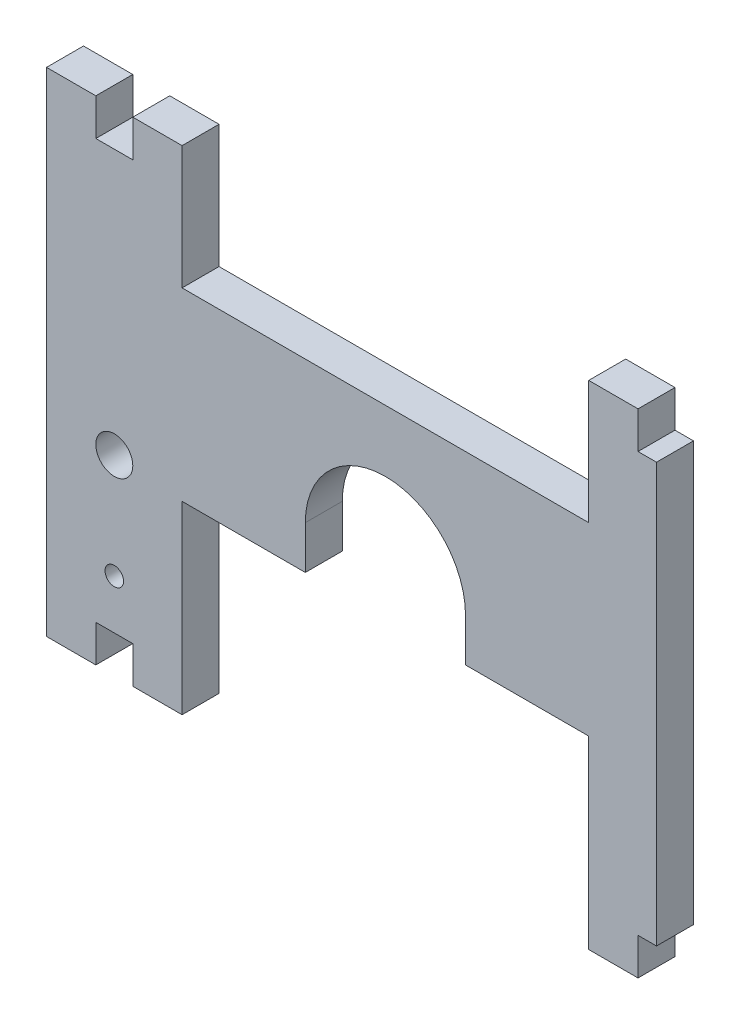
ISO-10303-21;
HEADER;
FILE_DESCRIPTION(('STEP AP214'),'2;1');
FILE_NAME('part.step','',(''),(''),'','','');
FILE_SCHEMA(('AUTOMOTIVE_DESIGN { 1 0 10303 214 1 1 1 1 }'));
ENDSEC;
DATA;
#1=APPLICATION_CONTEXT('core data for automotive mechanical design processes');
#2=APPLICATION_PROTOCOL_DEFINITION('international standard','automotive_design',2000,#1);
#3=PRODUCT_CONTEXT('',#1,'mechanical');
#4=PRODUCT('Part','Part','',(#3));
#5=PRODUCT_RELATED_PRODUCT_CATEGORY('part','',(#4));
#6=PRODUCT_DEFINITION_FORMATION('','',#4);
#7=PRODUCT_DEFINITION_CONTEXT('part definition',#1,'design');
#8=PRODUCT_DEFINITION('design','',#6,#7);
#9=PRODUCT_DEFINITION_SHAPE('','',#8);
#10=(LENGTH_UNIT() NAMED_UNIT(*) SI_UNIT(.MILLI.,.METRE.));
#11=(NAMED_UNIT(*) PLANE_ANGLE_UNIT() SI_UNIT($,.RADIAN.));
#12=(NAMED_UNIT(*) SI_UNIT($,.STERADIAN.) SOLID_ANGLE_UNIT());
#13=UNCERTAINTY_MEASURE_WITH_UNIT(LENGTH_MEASURE(1.E-05),#10,'distance_accuracy_value','');
#14=(GEOMETRIC_REPRESENTATION_CONTEXT(3) GLOBAL_UNCERTAINTY_ASSIGNED_CONTEXT((#13)) GLOBAL_UNIT_ASSIGNED_CONTEXT((#10,
#11,#12)) REPRESENTATION_CONTEXT('',''));
#15=CARTESIAN_POINT('',(0.,0.,0.));
#16=DIRECTION('',(0.,0.,1.));
#17=DIRECTION('',(1.,0.,0.));
#18=AXIS2_PLACEMENT_3D('',#15,#16,#17);
#19=CARTESIAN_POINT('',(0.,6.,6.));
#20=DIRECTION('',(0.,1.,0.));
#21=DIRECTION('',(0.,0.,1.));
#22=AXIS2_PLACEMENT_3D('',#19,#20,#21);
#23=PLANE('',#22);
#24=DIRECTION('',(1.,0.,0.));
#25=VECTOR('',#24,1.);
#26=CARTESIAN_POINT('',(0.,6.,0.));
#27=LINE('',#26,#25);
#28=CARTESIAN_POINT('',(-14.,6.,0.));
#29=VERTEX_POINT('',#28);
#30=CARTESIAN_POINT('',(-8.,6.,0.));
#31=VERTEX_POINT('',#30);
#32=EDGE_CURVE('E322',#29,#31,#27,.T.);
#33=ORIENTED_EDGE('',*,*,#32,.T.);
#34=DIRECTION('',(0.,0.,-1.));
#35=VECTOR('',#34,1.);
#36=CARTESIAN_POINT('',(-8.,6.,6.));
#37=LINE('',#36,#35);
#38=CARTESIAN_POINT('',(-8.,6.,6.));
#39=VERTEX_POINT('',#38);
#40=EDGE_CURVE('E44',#39,#31,#37,.T.);
#41=ORIENTED_EDGE('',*,*,#40,.F.);
#42=DIRECTION('',(1.,0.,0.));
#43=VECTOR('',#42,1.);
#44=CARTESIAN_POINT('',(0.,6.,6.));
#45=LINE('',#44,#43);
#46=CARTESIAN_POINT('',(-14.,6.,6.));
#47=VERTEX_POINT('',#46);
#48=EDGE_CURVE('E261',#47,#39,#45,.T.);
#49=ORIENTED_EDGE('',*,*,#48,.F.);
#50=DIRECTION('',(0.,0.,-1.));
#51=VECTOR('',#50,1.);
#52=CARTESIAN_POINT('',(-14.,6.,6.));
#53=LINE('',#52,#51);
#54=EDGE_CURVE('E251',#47,#29,#53,.T.);
#55=ORIENTED_EDGE('',*,*,#54,.T.);
#56=EDGE_LOOP('',(#33,#41,#49,#55));
#57=FACE_BOUND('',#56,.T.);
#58=ADVANCED_FACE('F37',(#57),#23,.F.);
#59=CARTESIAN_POINT('',(-8.,0.,6.));
#60=DIRECTION('',(1.,0.,0.));
#61=DIRECTION('',(0.,1.,0.));
#62=AXIS2_PLACEMENT_3D('',#59,#60,#61);
#63=PLANE('',#62);
#64=DIRECTION('',(0.,-1.,0.));
#65=VECTOR('',#64,1.);
#66=CARTESIAN_POINT('',(-8.,0.,0.));
#67=LINE('',#66,#65);
#68=CARTESIAN_POINT('',(-8.,0.,0.));
#69=VERTEX_POINT('',#68);
#70=EDGE_CURVE('E325',#31,#69,#67,.T.);
#71=ORIENTED_EDGE('',*,*,#70,.T.);
#72=DIRECTION('',(0.,0.,-1.));
#73=VECTOR('',#72,1.);
#74=CARTESIAN_POINT('',(-8.,0.,6.));
#75=LINE('',#74,#73);
#76=CARTESIAN_POINT('',(-8.,0.,6.));
#77=VERTEX_POINT('',#76);
#78=EDGE_CURVE('E430',#77,#69,#75,.T.);
#79=ORIENTED_EDGE('',*,*,#78,.F.);
#80=DIRECTION('',(0.,-1.,0.));
#81=VECTOR('',#80,1.);
#82=CARTESIAN_POINT('',(-8.,0.,6.));
#83=LINE('',#82,#81);
#84=EDGE_CURVE('E155',#39,#77,#83,.T.);
#85=ORIENTED_EDGE('',*,*,#84,.F.);
#86=ORIENTED_EDGE('',*,*,#40,.T.);
#87=EDGE_LOOP('',(#71,#79,#85,#86));
#88=FACE_BOUND('',#87,.T.);
#89=ADVANCED_FACE('F453',(#88),#63,.F.);
#90=CARTESIAN_POINT('',(0.,0.,6.));
#91=DIRECTION('',(0.,-1.,0.));
#92=DIRECTION('',(1.,0.,0.));
#93=AXIS2_PLACEMENT_3D('',#90,#91,#92);
#94=PLANE('',#93);
#95=DIRECTION('',(-1.,0.,0.));
#96=VECTOR('',#95,1.);
#97=CARTESIAN_POINT('',(0.,0.,0.));
#98=LINE('',#97,#96);
#99=CARTESIAN_POINT('',(0.,0.,0.));
#100=VERTEX_POINT('',#99);
#101=EDGE_CURVE('E328',#100,#69,#98,.T.);
#102=ORIENTED_EDGE('',*,*,#101,.F.);
#103=DIRECTION('',(0.,0.,-1.));
#104=VECTOR('',#103,1.);
#105=CARTESIAN_POINT('',(0.,0.,6.));
#106=LINE('',#105,#104);
#107=CARTESIAN_POINT('',(0.,0.,6.));
#108=VERTEX_POINT('',#107);
#109=EDGE_CURVE('E428',#108,#100,#106,.T.);
#110=ORIENTED_EDGE('',*,*,#109,.F.);
#111=DIRECTION('',(-1.,0.,0.));
#112=VECTOR('',#111,1.);
#113=CARTESIAN_POINT('',(0.,0.,6.));
#114=LINE('',#113,#112);
#115=EDGE_CURVE('E250',#108,#77,#114,.T.);
#116=ORIENTED_EDGE('',*,*,#115,.T.);
#117=ORIENTED_EDGE('',*,*,#78,.T.);
#118=EDGE_LOOP('',(#102,#110,#116,#117));
#119=FACE_BOUND('',#118,.T.);
#120=ADVANCED_FACE('F458',(#119),#94,.T.);
#121=CARTESIAN_POINT('',(0.,0.,6.));
#122=DIRECTION('',(-1.,0.,0.));
#123=DIRECTION('',(0.,0.,1.));
#124=AXIS2_PLACEMENT_3D('',#121,#122,#123);
#125=PLANE('',#124);
#126=DIRECTION('',(0.,1.,0.));
#127=VECTOR('',#126,1.);
#128=CARTESIAN_POINT('',(0.,0.,0.));
#129=LINE('',#128,#127);
#130=CARTESIAN_POINT('',(0.,30.,0.));
#131=VERTEX_POINT('',#130);
#132=EDGE_CURVE('E331',#100,#131,#129,.T.);
#133=ORIENTED_EDGE('',*,*,#132,.T.);
#134=DIRECTION('',(0.,0.,-1.));
#135=VECTOR('',#134,1.);
#136=CARTESIAN_POINT('',(0.,30.,6.));
#137=LINE('',#136,#135);
#138=CARTESIAN_POINT('',(0.,30.,6.));
#139=VERTEX_POINT('',#138);
#140=EDGE_CURVE('E426',#139,#131,#137,.T.);
#141=ORIENTED_EDGE('',*,*,#140,.F.);
#142=DIRECTION('',(0.,1.,0.));
#143=VECTOR('',#142,1.);
#144=CARTESIAN_POINT('',(0.,0.,6.));
#145=LINE('',#144,#143);
#146=EDGE_CURVE('E256',#108,#139,#145,.T.);
#147=ORIENTED_EDGE('',*,*,#146,.F.);
#148=ORIENTED_EDGE('',*,*,#109,.T.);
#149=EDGE_LOOP('',(#133,#141,#147,#148));
#150=FACE_BOUND('',#149,.T.);
#151=ADVANCED_FACE('F468',(#150),#125,.F.);
#152=CARTESIAN_POINT('',(0.,30.,6.));
#153=DIRECTION('',(0.,-1.,0.));
#154=DIRECTION('',(1.,0.,0.));
#155=AXIS2_PLACEMENT_3D('',#152,#153,#154);
#156=PLANE('',#155);
#157=DIRECTION('',(-1.,0.,0.));
#158=VECTOR('',#157,1.);
#159=CARTESIAN_POINT('',(0.,30.,0.));
#160=LINE('',#159,#158);
#161=CARTESIAN_POINT('',(20.,30.,0.));
#162=VERTEX_POINT('',#161);
#163=EDGE_CURVE('E335',#162,#131,#160,.T.);
#164=ORIENTED_EDGE('',*,*,#163,.F.);
#165=DIRECTION('',(0.,0.,-1.));
#166=VECTOR('',#165,1.);
#167=CARTESIAN_POINT('',(20.,30.,6.));
#168=LINE('',#167,#166);
#169=CARTESIAN_POINT('',(20.,30.,6.));
#170=VERTEX_POINT('',#169);
#171=EDGE_CURVE('E424',#170,#162,#168,.T.);
#172=ORIENTED_EDGE('',*,*,#171,.F.);
#173=DIRECTION('',(-1.,0.,0.));
#174=VECTOR('',#173,1.);
#175=CARTESIAN_POINT('',(0.,30.,6.));
#176=LINE('',#175,#174);
#177=EDGE_CURVE('E259',#170,#139,#176,.T.);
#178=ORIENTED_EDGE('',*,*,#177,.T.);
#179=ORIENTED_EDGE('',*,*,#140,.T.);
#180=EDGE_LOOP('',(#164,#172,#178,#179));
#181=FACE_BOUND('',#180,.T.);
#182=ADVANCED_FACE('F569',(#181),#156,.T.);
#183=CARTESIAN_POINT('',(20.,0.,6.));
#184=DIRECTION('',(1.,0.,0.));
#185=DIRECTION('',(0.,1.,0.));
#186=AXIS2_PLACEMENT_3D('',#183,#184,#185);
#187=PLANE('',#186);
#188=DIRECTION('',(0.,-1.,0.));
#189=VECTOR('',#188,1.);
#190=CARTESIAN_POINT('',(20.,0.,0.));
#191=LINE('',#190,#189);
#192=CARTESIAN_POINT('',(20.,37.,0.));
#193=VERTEX_POINT('',#192);
#194=EDGE_CURVE('E339',#193,#162,#191,.T.);
#195=ORIENTED_EDGE('',*,*,#194,.F.);
#196=DIRECTION('',(0.,0.,-1.));
#197=VECTOR('',#196,1.);
#198=CARTESIAN_POINT('',(20.,37.,6.));
#199=LINE('',#198,#197);
#200=CARTESIAN_POINT('',(20.,37.,6.));
#201=VERTEX_POINT('',#200);
#202=EDGE_CURVE('E422',#201,#193,#199,.T.);
#203=ORIENTED_EDGE('',*,*,#202,.F.);
#204=DIRECTION('',(0.,-1.,0.));
#205=VECTOR('',#204,1.);
#206=CARTESIAN_POINT('',(20.,0.,6.));
#207=LINE('',#206,#205);
#208=EDGE_CURVE('E474',#201,#170,#207,.T.);
#209=ORIENTED_EDGE('',*,*,#208,.T.);
#210=ORIENTED_EDGE('',*,*,#171,.T.);
#211=EDGE_LOOP('',(#195,#203,#209,#210));
#212=FACE_BOUND('',#211,.T.);
#213=ADVANCED_FACE('F481',(#212),#187,.T.);
#214=CARTESIAN_POINT('',(33.,37.,6.));
#215=DIRECTION('',(0.,0.,-1.));
#216=DIRECTION('',(-1.,0.,0.));
#217=AXIS2_PLACEMENT_3D('',#214,#215,#216);
#218=CYLINDRICAL_SURFACE('',#217,13.);
#219=CARTESIAN_POINT('',(33.,37.,0.));
#220=DIRECTION('',(0.,0.,1.));
#221=DIRECTION('',(1.,0.,0.));
#222=AXIS2_PLACEMENT_3D('',#219,#220,#221);
#223=CIRCLE('',#222,13.);
#224=CARTESIAN_POINT('',(46.,37.,0.));
#225=VERTEX_POINT('',#224);
#226=EDGE_CURVE('E343',#225,#193,#223,.T.);
#227=ORIENTED_EDGE('',*,*,#226,.F.);
#228=DIRECTION('',(0.,0.,-1.));
#229=VECTOR('',#228,1.);
#230=CARTESIAN_POINT('',(46.,37.,6.));
#231=LINE('',#230,#229);
#232=CARTESIAN_POINT('',(46.,37.,6.));
#233=VERTEX_POINT('',#232);
#234=EDGE_CURVE('E420',#233,#225,#231,.T.);
#235=ORIENTED_EDGE('',*,*,#234,.F.);
#236=CARTESIAN_POINT('',(33.,37.,6.));
#237=DIRECTION('',(0.,0.,1.));
#238=DIRECTION('',(1.,0.,0.));
#239=AXIS2_PLACEMENT_3D('',#236,#237,#238);
#240=CIRCLE('',#239,13.);
#241=EDGE_CURVE('E483',#233,#201,#240,.T.);
#242=ORIENTED_EDGE('',*,*,#241,.T.);
#243=ORIENTED_EDGE('',*,*,#202,.T.);
#244=EDGE_LOOP('',(#227,#235,#242,#243));
#245=FACE_BOUND('',#244,.T.);
#246=ADVANCED_FACE('F759',(#245),#218,.F.);
#247=CARTESIAN_POINT('',(46.,0.,6.));
#248=DIRECTION('',(1.,0.,0.));
#249=DIRECTION('',(0.,0.,-1.));
#250=AXIS2_PLACEMENT_3D('',#247,#248,#249);
#251=PLANE('',#250);
#252=DIRECTION('',(0.,-1.,0.));
#253=VECTOR('',#252,1.);
#254=CARTESIAN_POINT('',(46.,0.,0.));
#255=LINE('',#254,#253);
#256=CARTESIAN_POINT('',(46.,30.,0.));
#257=VERTEX_POINT('',#256);
#258=EDGE_CURVE('E346',#225,#257,#255,.T.);
#259=ORIENTED_EDGE('',*,*,#258,.T.);
#260=DIRECTION('',(0.,0.,-1.));
#261=VECTOR('',#260,1.);
#262=CARTESIAN_POINT('',(46.,30.,6.));
#263=LINE('',#262,#261);
#264=CARTESIAN_POINT('',(46.,30.,6.));
#265=VERTEX_POINT('',#264);
#266=EDGE_CURVE('E418',#265,#257,#263,.T.);
#267=ORIENTED_EDGE('',*,*,#266,.F.);
#268=DIRECTION('',(0.,-1.,0.));
#269=VECTOR('',#268,1.);
#270=CARTESIAN_POINT('',(46.,0.,6.));
#271=LINE('',#270,#269);
#272=EDGE_CURVE('E485',#233,#265,#271,.T.);
#273=ORIENTED_EDGE('',*,*,#272,.F.);
#274=ORIENTED_EDGE('',*,*,#234,.T.);
#275=EDGE_LOOP('',(#259,#267,#273,#274));
#276=FACE_BOUND('',#275,.T.);
#277=ADVANCED_FACE('F750',(#276),#251,.F.);
#278=CARTESIAN_POINT('',(66.,30.,0.));
#279=VERTEX_POINT('',#278);
#280=EDGE_CURVE('E340',#279,#257,#160,.T.);
#281=ORIENTED_EDGE('',*,*,#280,.F.);
#282=DIRECTION('',(0.,0.,-1.));
#283=VECTOR('',#282,1.);
#284=CARTESIAN_POINT('',(66.,30.,6.));
#285=LINE('',#284,#283);
#286=CARTESIAN_POINT('',(66.,30.,6.));
#287=VERTEX_POINT('',#286);
#288=EDGE_CURVE('E416',#287,#279,#285,.T.);
#289=ORIENTED_EDGE('',*,*,#288,.F.);
#290=EDGE_CURVE('E478',#287,#265,#176,.T.);
#291=ORIENTED_EDGE('',*,*,#290,.T.);
#292=ORIENTED_EDGE('',*,*,#266,.T.);
#293=EDGE_LOOP('',(#281,#289,#291,#292));
#294=FACE_BOUND('',#293,.T.);
#295=ADVANCED_FACE('F575',(#294),#156,.T.);
#296=CARTESIAN_POINT('',(66.,0.,6.));
#297=DIRECTION('',(1.,0.,0.));
#298=DIRECTION('',(0.,1.,0.));
#299=AXIS2_PLACEMENT_3D('',#296,#297,#298);
#300=PLANE('',#299);
#301=DIRECTION('',(0.,-1.,0.));
#302=VECTOR('',#301,1.);
#303=CARTESIAN_POINT('',(66.,0.,0.));
#304=LINE('',#303,#302);
#305=CARTESIAN_POINT('',(66.,0.,0.));
#306=VERTEX_POINT('',#305);
#307=EDGE_CURVE('E349',#279,#306,#304,.T.);
#308=ORIENTED_EDGE('',*,*,#307,.T.);
#309=DIRECTION('',(0.,0.,-1.));
#310=VECTOR('',#309,1.);
#311=CARTESIAN_POINT('',(66.,0.,6.));
#312=LINE('',#311,#310);
#313=CARTESIAN_POINT('',(66.,0.,6.));
#314=VERTEX_POINT('',#313);
#315=EDGE_CURVE('E413',#314,#306,#312,.T.);
#316=ORIENTED_EDGE('',*,*,#315,.F.);
#317=DIRECTION('',(0.,-1.,0.));
#318=VECTOR('',#317,1.);
#319=CARTESIAN_POINT('',(66.,0.,6.));
#320=LINE('',#319,#318);
#321=EDGE_CURVE('E489',#287,#314,#320,.T.);
#322=ORIENTED_EDGE('',*,*,#321,.F.);
#323=ORIENTED_EDGE('',*,*,#288,.T.);
#324=EDGE_LOOP('',(#308,#316,#322,#323));
#325=FACE_BOUND('',#324,.T.);
#326=ADVANCED_FACE('F704',(#325),#300,.F.);
#327=CARTESIAN_POINT('',(0.,0.,6.));
#328=DIRECTION('',(0.,1.,0.));
#329=DIRECTION('',(0.,0.,1.));
#330=AXIS2_PLACEMENT_3D('',#327,#328,#329);
#331=PLANE('',#330);
#332=DIRECTION('',(1.,0.,0.));
#333=VECTOR('',#332,1.);
#334=CARTESIAN_POINT('',(0.,0.,0.));
#335=LINE('',#334,#333);
#336=CARTESIAN_POINT('',(74.,0.,0.));
#337=VERTEX_POINT('',#336);
#338=EDGE_CURVE('E351',#306,#337,#335,.T.);
#339=ORIENTED_EDGE('',*,*,#338,.T.);
#340=DIRECTION('',(0.,0.,-1.));
#341=VECTOR('',#340,1.);
#342=CARTESIAN_POINT('',(74.,0.,6.));
#343=LINE('',#342,#341);
#344=CARTESIAN_POINT('',(74.,0.,6.));
#345=VERTEX_POINT('',#344);
#346=EDGE_CURVE('E410',#345,#337,#343,.T.);
#347=ORIENTED_EDGE('',*,*,#346,.F.);
#348=DIRECTION('',(1.,0.,0.));
#349=VECTOR('',#348,1.);
#350=CARTESIAN_POINT('',(0.,0.,6.));
#351=LINE('',#350,#349);
#352=EDGE_CURVE('E299',#314,#345,#351,.T.);
#353=ORIENTED_EDGE('',*,*,#352,.F.);
#354=ORIENTED_EDGE('',*,*,#315,.T.);
#355=EDGE_LOOP('',(#339,#347,#353,#354));
#356=FACE_BOUND('',#355,.T.);
#357=ADVANCED_FACE('F496',(#356),#331,.F.);
#358=CARTESIAN_POINT('',(74.,1.71159382963045E-13,6.));
#359=DIRECTION('',(-1.,0.,0.));
#360=DIRECTION('',(0.,-1.,0.));
#361=AXIS2_PLACEMENT_3D('',#358,#359,#360);
#362=PLANE('',#361);
#363=DIRECTION('',(0.,1.,0.));
#364=VECTOR('',#363,1.);
#365=CARTESIAN_POINT('',(74.,1.71159382963045E-13,0.));
#366=LINE('',#365,#364);
#367=CARTESIAN_POINT('',(74.,6.,0.));
#368=VERTEX_POINT('',#367);
#369=EDGE_CURVE('E354',#337,#368,#366,.T.);
#370=ORIENTED_EDGE('',*,*,#369,.T.);
#371=DIRECTION('',(0.,0.,-1.));
#372=VECTOR('',#371,1.);
#373=CARTESIAN_POINT('',(74.,6.,6.));
#374=LINE('',#373,#372);
#375=CARTESIAN_POINT('',(74.,6.,6.));
#376=VERTEX_POINT('',#375);
#377=EDGE_CURVE('E408',#376,#368,#374,.T.);
#378=ORIENTED_EDGE('',*,*,#377,.F.);
#379=DIRECTION('',(0.,1.,0.));
#380=VECTOR('',#379,1.);
#381=CARTESIAN_POINT('',(74.,1.71159382963045E-13,6.));
#382=LINE('',#381,#380);
#383=EDGE_CURVE('E293',#345,#376,#382,.T.);
#384=ORIENTED_EDGE('',*,*,#383,.F.);
#385=ORIENTED_EDGE('',*,*,#346,.T.);
#386=EDGE_LOOP('',(#370,#378,#384,#385));
#387=FACE_BOUND('',#386,.T.);
#388=ADVANCED_FACE('F500',(#387),#362,.F.);
#389=CARTESIAN_POINT('',(0.,6.,6.));
#390=DIRECTION('',(0.,1.,0.));
#391=DIRECTION('',(0.,0.,1.));
#392=AXIS2_PLACEMENT_3D('',#389,#390,#391);
#393=PLANE('',#392);
#394=DIRECTION('',(1.,0.,0.));
#395=VECTOR('',#394,1.);
#396=CARTESIAN_POINT('',(0.,6.,0.));
#397=LINE('',#396,#395);
#398=CARTESIAN_POINT('',(77.,6.,0.));
#399=VERTEX_POINT('',#398);
#400=EDGE_CURVE('E291',#368,#399,#397,.T.);
#401=ORIENTED_EDGE('',*,*,#400,.T.);
#402=DIRECTION('',(0.,0.,1.));
#403=VECTOR('',#402,1.);
#404=CARTESIAN_POINT('',(77.,6.,-4.));
#405=LINE('',#404,#403);
#406=CARTESIAN_POINT('',(77.,6.,6.));
#407=VERTEX_POINT('',#406);
#408=EDGE_CURVE('E51',#399,#407,#405,.T.);
#409=ORIENTED_EDGE('',*,*,#408,.T.);
#410=DIRECTION('',(1.,0.,0.));
#411=VECTOR('',#410,1.);
#412=CARTESIAN_POINT('',(0.,6.,6.));
#413=LINE('',#412,#411);
#414=EDGE_CURVE('E289',#376,#407,#413,.T.);
#415=ORIENTED_EDGE('',*,*,#414,.F.);
#416=ORIENTED_EDGE('',*,*,#377,.T.);
#417=EDGE_LOOP('',(#401,#409,#415,#416));
#418=FACE_BOUND('',#417,.T.);
#419=ADVANCED_FACE('F287',(#418),#393,.F.);
#420=CARTESIAN_POINT('',(0.,74.,6.));
#421=DIRECTION('',(0.,1.,0.));
#422=DIRECTION('',(0.,0.,1.));
#423=AXIS2_PLACEMENT_3D('',#420,#421,#422);
#424=PLANE('',#423);
#425=DIRECTION('',(0.,0.,1.));
#426=VECTOR('',#425,1.);
#427=CARTESIAN_POINT('',(77.,74.,-4.));
#428=LINE('',#427,#426);
#429=CARTESIAN_POINT('',(77.,74.,0.));
#430=VERTEX_POINT('',#429);
#431=CARTESIAN_POINT('',(77.,74.,6.));
#432=VERTEX_POINT('',#431);
#433=EDGE_CURVE('E272',#430,#432,#428,.T.);
#434=ORIENTED_EDGE('',*,*,#433,.F.);
#435=DIRECTION('',(1.,0.,0.));
#436=VECTOR('',#435,1.);
#437=CARTESIAN_POINT('',(0.,74.,0.));
#438=LINE('',#437,#436);
#439=CARTESIAN_POINT('',(74.,74.,0.));
#440=VERTEX_POINT('',#439);
#441=EDGE_CURVE('E357',#440,#430,#438,.T.);
#442=ORIENTED_EDGE('',*,*,#441,.F.);
#443=DIRECTION('',(0.,0.,-1.));
#444=VECTOR('',#443,1.);
#445=CARTESIAN_POINT('',(74.,74.,6.));
#446=LINE('',#445,#444);
#447=CARTESIAN_POINT('',(74.,74.,6.));
#448=VERTEX_POINT('',#447);
#449=EDGE_CURVE('E406',#448,#440,#446,.T.);
#450=ORIENTED_EDGE('',*,*,#449,.F.);
#451=DIRECTION('',(1.,0.,0.));
#452=VECTOR('',#451,1.);
#453=CARTESIAN_POINT('',(0.,74.,6.));
#454=LINE('',#453,#452);
#455=EDGE_CURVE('E295',#448,#432,#454,.T.);
#456=ORIENTED_EDGE('',*,*,#455,.T.);
#457=EDGE_LOOP('',(#434,#442,#450,#456));
#458=FACE_BOUND('',#457,.T.);
#459=ADVANCED_FACE('F503',(#458),#424,.T.);
#460=CARTESIAN_POINT('',(74.,0.,6.));
#461=DIRECTION('',(1.,0.,0.));
#462=DIRECTION('',(0.,0.,-1.));
#463=AXIS2_PLACEMENT_3D('',#460,#461,#462);
#464=PLANE('',#463);
#465=DIRECTION('',(0.,-1.,0.));
#466=VECTOR('',#465,1.);
#467=CARTESIAN_POINT('',(74.,0.,0.));
#468=LINE('',#467,#466);
#469=CARTESIAN_POINT('',(74.,80.,0.));
#470=VERTEX_POINT('',#469);
#471=EDGE_CURVE('E360',#470,#440,#468,.T.);
#472=ORIENTED_EDGE('',*,*,#471,.F.);
#473=DIRECTION('',(0.,0.,-1.));
#474=VECTOR('',#473,1.);
#475=CARTESIAN_POINT('',(74.,80.,6.));
#476=LINE('',#475,#474);
#477=CARTESIAN_POINT('',(74.,80.,6.));
#478=VERTEX_POINT('',#477);
#479=EDGE_CURVE('E404',#478,#470,#476,.T.);
#480=ORIENTED_EDGE('',*,*,#479,.F.);
#481=DIRECTION('',(0.,-1.,0.));
#482=VECTOR('',#481,1.);
#483=CARTESIAN_POINT('',(74.,0.,6.));
#484=LINE('',#483,#482);
#485=EDGE_CURVE('E297',#478,#448,#484,.T.);
#486=ORIENTED_EDGE('',*,*,#485,.T.);
#487=ORIENTED_EDGE('',*,*,#449,.T.);
#488=EDGE_LOOP('',(#472,#480,#486,#487));
#489=FACE_BOUND('',#488,.T.);
#490=ADVANCED_FACE('F508',(#489),#464,.T.);
#491=CARTESIAN_POINT('',(0.,80.,6.));
#492=DIRECTION('',(0.,-1.,0.));
#493=DIRECTION('',(0.,0.,-1.));
#494=AXIS2_PLACEMENT_3D('',#491,#492,#493);
#495=PLANE('',#494);
#496=DIRECTION('',(-1.,0.,0.));
#497=VECTOR('',#496,1.);
#498=CARTESIAN_POINT('',(0.,80.,0.));
#499=LINE('',#498,#497);
#500=CARTESIAN_POINT('',(66.,80.,0.));
#501=VERTEX_POINT('',#500);
#502=EDGE_CURVE('E358',#470,#501,#499,.T.);
#503=ORIENTED_EDGE('',*,*,#502,.T.);
#504=DIRECTION('',(0.,0.,-1.));
#505=VECTOR('',#504,1.);
#506=CARTESIAN_POINT('',(66.,80.,6.));
#507=LINE('',#506,#505);
#508=CARTESIAN_POINT('',(66.,80.,6.));
#509=VERTEX_POINT('',#508);
#510=EDGE_CURVE('E401',#509,#501,#507,.T.);
#511=ORIENTED_EDGE('',*,*,#510,.F.);
#512=DIRECTION('',(-1.,0.,0.));
#513=VECTOR('',#512,1.);
#514=CARTESIAN_POINT('',(0.,80.,6.));
#515=LINE('',#514,#513);
#516=EDGE_CURVE('E303',#478,#509,#515,.T.);
#517=ORIENTED_EDGE('',*,*,#516,.F.);
#518=ORIENTED_EDGE('',*,*,#479,.T.);
#519=EDGE_LOOP('',(#503,#511,#517,#518));
#520=FACE_BOUND('',#519,.T.);
#521=ADVANCED_FACE('F513',(#520),#495,.F.);
#522=CARTESIAN_POINT('',(66.,60.,0.));
#523=VERTEX_POINT('',#522);
#524=EDGE_CURVE('E352',#501,#523,#304,.T.);
#525=ORIENTED_EDGE('',*,*,#524,.T.);
#526=DIRECTION('',(0.,0.,-1.));
#527=VECTOR('',#526,1.);
#528=CARTESIAN_POINT('',(66.,60.,6.));
#529=LINE('',#528,#527);
#530=CARTESIAN_POINT('',(66.,60.,6.));
#531=VERTEX_POINT('',#530);
#532=EDGE_CURVE('E399',#531,#523,#529,.T.);
#533=ORIENTED_EDGE('',*,*,#532,.F.);
#534=EDGE_CURVE('E304',#509,#531,#320,.T.);
#535=ORIENTED_EDGE('',*,*,#534,.F.);
#536=ORIENTED_EDGE('',*,*,#510,.T.);
#537=EDGE_LOOP('',(#525,#533,#535,#536));
#538=FACE_BOUND('',#537,.T.);
#539=ADVANCED_FACE('F519',(#538),#300,.F.);
#540=CARTESIAN_POINT('',(0.,60.,6.));
#541=DIRECTION('',(0.,1.,0.));
#542=DIRECTION('',(0.,0.,1.));
#543=AXIS2_PLACEMENT_3D('',#540,#541,#542);
#544=PLANE('',#543);
#545=DIRECTION('',(1.,0.,0.));
#546=VECTOR('',#545,1.);
#547=CARTESIAN_POINT('',(0.,60.,0.));
#548=LINE('',#547,#546);
#549=CARTESIAN_POINT('',(0.,60.,0.));
#550=VERTEX_POINT('',#549);
#551=EDGE_CURVE('E365',#550,#523,#548,.T.);
#552=ORIENTED_EDGE('',*,*,#551,.F.);
#553=DIRECTION('',(0.,0.,-1.));
#554=VECTOR('',#553,1.);
#555=CARTESIAN_POINT('',(0.,60.,6.));
#556=LINE('',#555,#554);
#557=CARTESIAN_POINT('',(0.,60.,6.));
#558=VERTEX_POINT('',#557);
#559=EDGE_CURVE('E397',#558,#550,#556,.T.);
#560=ORIENTED_EDGE('',*,*,#559,.F.);
#561=DIRECTION('',(1.,0.,0.));
#562=VECTOR('',#561,1.);
#563=CARTESIAN_POINT('',(0.,60.,6.));
#564=LINE('',#563,#562);
#565=EDGE_CURVE('E308',#558,#531,#564,.T.);
#566=ORIENTED_EDGE('',*,*,#565,.T.);
#567=ORIENTED_EDGE('',*,*,#532,.T.);
#568=EDGE_LOOP('',(#552,#560,#566,#567));
#569=FACE_BOUND('',#568,.T.);
#570=ADVANCED_FACE('F523',(#569),#544,.T.);
#571=CARTESIAN_POINT('',(0.,80.,0.));
#572=VERTEX_POINT('',#571);
#573=EDGE_CURVE('E336',#550,#572,#129,.T.);
#574=ORIENTED_EDGE('',*,*,#573,.T.);
#575=DIRECTION('',(0.,0.,-1.));
#576=VECTOR('',#575,1.);
#577=CARTESIAN_POINT('',(0.,80.,6.));
#578=LINE('',#577,#576);
#579=CARTESIAN_POINT('',(0.,80.,6.));
#580=VERTEX_POINT('',#579);
#581=EDGE_CURVE('E394',#580,#572,#578,.T.);
#582=ORIENTED_EDGE('',*,*,#581,.F.);
#583=EDGE_CURVE('E260',#558,#580,#145,.T.);
#584=ORIENTED_EDGE('',*,*,#583,.F.);
#585=ORIENTED_EDGE('',*,*,#559,.T.);
#586=EDGE_LOOP('',(#574,#582,#584,#585));
#587=FACE_BOUND('',#586,.T.);
#588=ADVANCED_FACE('F528',(#587),#125,.F.);
#589=CARTESIAN_POINT('',(0.,80.,6.));
#590=DIRECTION('',(0.,-1.,0.));
#591=DIRECTION('',(0.,0.,-1.));
#592=AXIS2_PLACEMENT_3D('',#589,#590,#591);
#593=PLANE('',#592);
#594=DIRECTION('',(-1.,0.,0.));
#595=VECTOR('',#594,1.);
#596=CARTESIAN_POINT('',(0.,80.,0.));
#597=LINE('',#596,#595);
#598=CARTESIAN_POINT('',(-8.,80.,0.));
#599=VERTEX_POINT('',#598);
#600=EDGE_CURVE('E368',#572,#599,#597,.T.);
#601=ORIENTED_EDGE('',*,*,#600,.T.);
#602=DIRECTION('',(0.,0.,-1.));
#603=VECTOR('',#602,1.);
#604=CARTESIAN_POINT('',(-8.,80.,6.));
#605=LINE('',#604,#603);
#606=CARTESIAN_POINT('',(-8.,80.,6.));
#607=VERTEX_POINT('',#606);
#608=EDGE_CURVE('E392',#607,#599,#605,.T.);
#609=ORIENTED_EDGE('',*,*,#608,.F.);
#610=DIRECTION('',(-1.,0.,0.));
#611=VECTOR('',#610,1.);
#612=CARTESIAN_POINT('',(0.,80.,6.));
#613=LINE('',#612,#611);
#614=EDGE_CURVE('E311',#580,#607,#613,.T.);
#615=ORIENTED_EDGE('',*,*,#614,.F.);
#616=ORIENTED_EDGE('',*,*,#581,.T.);
#617=EDGE_LOOP('',(#601,#609,#615,#616));
#618=FACE_BOUND('',#617,.T.);
#619=ADVANCED_FACE('F534',(#618),#593,.F.);
#620=CARTESIAN_POINT('',(-8.,0.,6.));
#621=DIRECTION('',(-1.,0.,0.));
#622=DIRECTION('',(0.,0.,1.));
#623=AXIS2_PLACEMENT_3D('',#620,#621,#622);
#624=PLANE('',#623);
#625=DIRECTION('',(0.,1.,0.));
#626=VECTOR('',#625,1.);
#627=CARTESIAN_POINT('',(-8.,0.,0.));
#628=LINE('',#627,#626);
#629=CARTESIAN_POINT('',(-8.,74.,0.));
#630=VERTEX_POINT('',#629);
#631=EDGE_CURVE('E371',#630,#599,#628,.T.);
#632=ORIENTED_EDGE('',*,*,#631,.F.);
#633=DIRECTION('',(0.,0.,-1.));
#634=VECTOR('',#633,1.);
#635=CARTESIAN_POINT('',(-8.,74.,6.));
#636=LINE('',#635,#634);
#637=CARTESIAN_POINT('',(-8.,74.,6.));
#638=VERTEX_POINT('',#637);
#639=EDGE_CURVE('E390',#638,#630,#636,.T.);
#640=ORIENTED_EDGE('',*,*,#639,.F.);
#641=DIRECTION('',(0.,1.,0.));
#642=VECTOR('',#641,1.);
#643=CARTESIAN_POINT('',(-8.,0.,6.));
#644=LINE('',#643,#642);
#645=EDGE_CURVE('E313',#638,#607,#644,.T.);
#646=ORIENTED_EDGE('',*,*,#645,.T.);
#647=ORIENTED_EDGE('',*,*,#608,.T.);
#648=EDGE_LOOP('',(#632,#640,#646,#647));
#649=FACE_BOUND('',#648,.T.);
#650=ADVANCED_FACE('F538',(#649),#624,.T.);
#651=CARTESIAN_POINT('',(0.,74.,6.));
#652=DIRECTION('',(0.,1.,0.));
#653=DIRECTION('',(0.,0.,1.));
#654=AXIS2_PLACEMENT_3D('',#651,#652,#653);
#655=PLANE('',#654);
#656=DIRECTION('',(1.,0.,0.));
#657=VECTOR('',#656,1.);
#658=CARTESIAN_POINT('',(0.,74.,0.));
#659=LINE('',#658,#657);
#660=CARTESIAN_POINT('',(-14.,74.,0.));
#661=VERTEX_POINT('',#660);
#662=EDGE_CURVE('E375',#661,#630,#659,.T.);
#663=ORIENTED_EDGE('',*,*,#662,.F.);
#664=DIRECTION('',(0.,0.,-1.));
#665=VECTOR('',#664,1.);
#666=CARTESIAN_POINT('',(-14.,74.,6.));
#667=LINE('',#666,#665);
#668=CARTESIAN_POINT('',(-14.,74.,6.));
#669=VERTEX_POINT('',#668);
#670=EDGE_CURVE('E388',#669,#661,#667,.T.);
#671=ORIENTED_EDGE('',*,*,#670,.F.);
#672=DIRECTION('',(1.,0.,0.));
#673=VECTOR('',#672,1.);
#674=CARTESIAN_POINT('',(0.,74.,6.));
#675=LINE('',#674,#673);
#676=EDGE_CURVE('E316',#669,#638,#675,.T.);
#677=ORIENTED_EDGE('',*,*,#676,.T.);
#678=ORIENTED_EDGE('',*,*,#639,.T.);
#679=EDGE_LOOP('',(#663,#671,#677,#678));
#680=FACE_BOUND('',#679,.T.);
#681=ADVANCED_FACE('F541',(#680),#655,.T.);
#682=CARTESIAN_POINT('',(-13.9999999999999,0.,6.));
#683=DIRECTION('',(1.,0.,0.));
#684=DIRECTION('',(0.,1.,0.));
#685=AXIS2_PLACEMENT_3D('',#682,#683,#684);
#686=PLANE('',#685);
#687=DIRECTION('',(0.,-1.,0.));
#688=VECTOR('',#687,1.);
#689=CARTESIAN_POINT('',(-13.9999999999999,0.,0.));
#690=LINE('',#689,#688);
#691=CARTESIAN_POINT('',(-14.,80.,0.));
#692=VERTEX_POINT('',#691);
#693=EDGE_CURVE('E378',#692,#661,#690,.T.);
#694=ORIENTED_EDGE('',*,*,#693,.F.);
#695=DIRECTION('',(0.,0.,-1.));
#696=VECTOR('',#695,1.);
#697=CARTESIAN_POINT('',(-14.,80.,6.));
#698=LINE('',#697,#696);
#699=CARTESIAN_POINT('',(-14.,80.,6.));
#700=VERTEX_POINT('',#699);
#701=EDGE_CURVE('E386',#700,#692,#698,.T.);
#702=ORIENTED_EDGE('',*,*,#701,.F.);
#703=DIRECTION('',(0.,-1.,0.));
#704=VECTOR('',#703,1.);
#705=CARTESIAN_POINT('',(-13.9999999999999,0.,6.));
#706=LINE('',#705,#704);
#707=EDGE_CURVE('E319',#700,#669,#706,.T.);
#708=ORIENTED_EDGE('',*,*,#707,.T.);
#709=ORIENTED_EDGE('',*,*,#670,.T.);
#710=EDGE_LOOP('',(#694,#702,#708,#709));
#711=FACE_BOUND('',#710,.T.);
#712=ADVANCED_FACE('F544',(#711),#686,.T.);
#713=CARTESIAN_POINT('',(-22.,80.,0.));
#714=VERTEX_POINT('',#713);
#715=EDGE_CURVE('E372',#692,#714,#597,.T.);
#716=ORIENTED_EDGE('',*,*,#715,.T.);
#717=DIRECTION('',(0.,0.,-1.));
#718=VECTOR('',#717,1.);
#719=CARTESIAN_POINT('',(-22.,80.,6.));
#720=LINE('',#719,#718);
#721=CARTESIAN_POINT('',(-22.,80.,6.));
#722=VERTEX_POINT('',#721);
#723=EDGE_CURVE('E236',#722,#714,#720,.T.);
#724=ORIENTED_EDGE('',*,*,#723,.F.);
#725=EDGE_CURVE('E245',#700,#722,#613,.T.);
#726=ORIENTED_EDGE('',*,*,#725,.F.);
#727=ORIENTED_EDGE('',*,*,#701,.T.);
#728=EDGE_LOOP('',(#716,#724,#726,#727));
#729=FACE_BOUND('',#728,.T.);
#730=ADVANCED_FACE('F548',(#729),#593,.F.);
#731=CARTESIAN_POINT('',(-22.,0.,6.));
#732=DIRECTION('',(-1.,0.,0.));
#733=DIRECTION('',(0.,-1.,0.));
#734=AXIS2_PLACEMENT_3D('',#731,#732,#733);
#735=PLANE('',#734);
#736=DIRECTION('',(0.,1.,0.));
#737=VECTOR('',#736,1.);
#738=CARTESIAN_POINT('',(-22.,0.,0.));
#739=LINE('',#738,#737);
#740=CARTESIAN_POINT('',(-22.,0.,0.));
#741=VERTEX_POINT('',#740);
#742=EDGE_CURVE('E231',#741,#714,#739,.T.);
#743=ORIENTED_EDGE('',*,*,#742,.F.);
#744=DIRECTION('',(0.,0.,-1.));
#745=VECTOR('',#744,1.);
#746=CARTESIAN_POINT('',(-22.,0.,6.));
#747=LINE('',#746,#745);
#748=CARTESIAN_POINT('',(-22.,0.,6.));
#749=VERTEX_POINT('',#748);
#750=EDGE_CURVE('E226',#749,#741,#747,.T.);
#751=ORIENTED_EDGE('',*,*,#750,.F.);
#752=DIRECTION('',(0.,1.,0.));
#753=VECTOR('',#752,1.);
#754=CARTESIAN_POINT('',(-22.,0.,6.));
#755=LINE('',#754,#753);
#756=EDGE_CURVE('E229',#749,#722,#755,.T.);
#757=ORIENTED_EDGE('',*,*,#756,.T.);
#758=ORIENTED_EDGE('',*,*,#723,.T.);
#759=EDGE_LOOP('',(#743,#751,#757,#758));
#760=FACE_BOUND('',#759,.T.);
#761=ADVANCED_FACE('F228',(#760),#735,.T.);
#762=CARTESIAN_POINT('',(-14.,0.,0.));
#763=VERTEX_POINT('',#762);
#764=EDGE_CURVE('E332',#763,#741,#98,.T.);
#765=ORIENTED_EDGE('',*,*,#764,.F.);
#766=DIRECTION('',(0.,0.,-1.));
#767=VECTOR('',#766,1.);
#768=CARTESIAN_POINT('',(-14.,0.,6.));
#769=LINE('',#768,#767);
#770=CARTESIAN_POINT('',(-14.,0.,6.));
#771=VERTEX_POINT('',#770);
#772=EDGE_CURVE('E237',#771,#763,#769,.T.);
#773=ORIENTED_EDGE('',*,*,#772,.F.);
#774=EDGE_CURVE('E242',#771,#749,#114,.T.);
#775=ORIENTED_EDGE('',*,*,#774,.T.);
#776=ORIENTED_EDGE('',*,*,#750,.T.);
#777=EDGE_LOOP('',(#765,#773,#775,#776));
#778=FACE_BOUND('',#777,.T.);
#779=ADVANCED_FACE('F248',(#778),#94,.T.);
#780=CARTESIAN_POINT('',(-14.,0.,6.));
#781=DIRECTION('',(-1.,0.,0.));
#782=DIRECTION('',(0.,-1.,0.));
#783=AXIS2_PLACEMENT_3D('',#780,#781,#782);
#784=PLANE('',#783);
#785=DIRECTION('',(0.,1.,0.));
#786=VECTOR('',#785,1.);
#787=CARTESIAN_POINT('',(-14.,0.,0.));
#788=LINE('',#787,#786);
#789=EDGE_CURVE('E146',#763,#29,#788,.T.);
#790=ORIENTED_EDGE('',*,*,#789,.T.);
#791=ORIENTED_EDGE('',*,*,#54,.F.);
#792=DIRECTION('',(0.,1.,0.));
#793=VECTOR('',#792,1.);
#794=CARTESIAN_POINT('',(-14.,0.,6.));
#795=LINE('',#794,#793);
#796=EDGE_CURVE('E59',#771,#47,#795,.T.);
#797=ORIENTED_EDGE('',*,*,#796,.F.);
#798=ORIENTED_EDGE('',*,*,#772,.T.);
#799=EDGE_LOOP('',(#790,#791,#797,#798));
#800=FACE_BOUND('',#799,.T.);
#801=ADVANCED_FACE('F581',(#800),#784,.F.);
#802=CARTESIAN_POINT('',(0.,0.,6.));
#803=DIRECTION('',(0.,0.,1.));
#804=DIRECTION('',(1.,0.,0.));
#805=AXIS2_PLACEMENT_3D('',#802,#803,#804);
#806=PLANE('',#805);
#807=DIRECTION('',(0.,-1.,0.));
#808=VECTOR('',#807,1.);
#809=CARTESIAN_POINT('',(77.,74.,6.));
#810=LINE('',#809,#808);
#811=EDGE_CURVE('E275',#432,#407,#810,.T.);
#812=ORIENTED_EDGE('',*,*,#811,.F.);
#813=ORIENTED_EDGE('',*,*,#455,.F.);
#814=ORIENTED_EDGE('',*,*,#485,.F.);
#815=ORIENTED_EDGE('',*,*,#516,.T.);
#816=ORIENTED_EDGE('',*,*,#534,.T.);
#817=ORIENTED_EDGE('',*,*,#565,.F.);
#818=ORIENTED_EDGE('',*,*,#583,.T.);
#819=ORIENTED_EDGE('',*,*,#614,.T.);
#820=ORIENTED_EDGE('',*,*,#645,.F.);
#821=ORIENTED_EDGE('',*,*,#676,.F.);
#822=ORIENTED_EDGE('',*,*,#707,.F.);
#823=ORIENTED_EDGE('',*,*,#725,.T.);
#824=ORIENTED_EDGE('',*,*,#756,.F.);
#825=ORIENTED_EDGE('',*,*,#774,.F.);
#826=ORIENTED_EDGE('',*,*,#796,.T.);
#827=ORIENTED_EDGE('',*,*,#48,.T.);
#828=ORIENTED_EDGE('',*,*,#84,.T.);
#829=ORIENTED_EDGE('',*,*,#115,.F.);
#830=ORIENTED_EDGE('',*,*,#146,.T.);
#831=ORIENTED_EDGE('',*,*,#177,.F.);
#832=ORIENTED_EDGE('',*,*,#208,.F.);
#833=ORIENTED_EDGE('',*,*,#241,.F.);
#834=ORIENTED_EDGE('',*,*,#272,.T.);
#835=ORIENTED_EDGE('',*,*,#290,.F.);
#836=ORIENTED_EDGE('',*,*,#321,.T.);
#837=ORIENTED_EDGE('',*,*,#352,.T.);
#838=ORIENTED_EDGE('',*,*,#383,.T.);
#839=ORIENTED_EDGE('',*,*,#414,.T.);
#840=EDGE_LOOP('',(#812,#813,#814,#815,#816,#817,#818,#819,#820,#821,#822,#823,#824,#825,#826,
#827,#828,#829,#830,#831,#832,#833,#834,#835,#836,#837,#838,#839));
#841=FACE_BOUND('',#840,.T.);
#842=CARTESIAN_POINT('',(-11.,14.,6.));
#843=DIRECTION('',(0.,0.,1.));
#844=DIRECTION('',(1.,0.,0.));
#845=AXIS2_PLACEMENT_3D('',#842,#843,#844);
#846=CIRCLE('',#845,1.5);
#847=CARTESIAN_POINT('',(-9.5,14.,6.));
#848=VERTEX_POINT('',#847);
#849=EDGE_CURVE('E269',#848,#848,#846,.T.);
#850=ORIENTED_EDGE('',*,*,#849,.F.);
#851=EDGE_LOOP('',(#850));
#852=FACE_BOUND('',#851,.T.);
#853=CARTESIAN_POINT('',(-11.,31.,6.));
#854=DIRECTION('',(0.,0.,1.));
#855=DIRECTION('',(1.,0.,0.));
#856=AXIS2_PLACEMENT_3D('',#853,#854,#855);
#857=CIRCLE('',#856,3.);
#858=CARTESIAN_POINT('',(-8.,31.,6.));
#859=VERTEX_POINT('',#858);
#860=EDGE_CURVE('E264',#859,#859,#857,.T.);
#861=ORIENTED_EDGE('',*,*,#860,.F.);
#862=EDGE_LOOP('',(#861));
#863=FACE_BOUND('',#862,.T.);
#864=ADVANCED_FACE('F240',(#841,#852,#863),#806,.T.);
#865=CARTESIAN_POINT('',(0.,0.,0.));
#866=DIRECTION('',(0.,0.,1.));
#867=DIRECTION('',(1.,0.,0.));
#868=AXIS2_PLACEMENT_3D('',#865,#866,#867);
#869=PLANE('',#868);
#870=CARTESIAN_POINT('',(-11.,14.,0.));
#871=DIRECTION('',(0.,0.,1.));
#872=DIRECTION('',(1.,0.,0.));
#873=AXIS2_PLACEMENT_3D('',#870,#871,#872);
#874=CIRCLE('',#873,1.5);
#875=CARTESIAN_POINT('',(-9.5,14.,0.));
#876=VERTEX_POINT('',#875);
#877=EDGE_CURVE('E268',#876,#876,#874,.T.);
#878=ORIENTED_EDGE('',*,*,#877,.T.);
#879=EDGE_LOOP('',(#878));
#880=FACE_BOUND('',#879,.T.);
#881=CARTESIAN_POINT('',(-11.,31.,0.));
#882=DIRECTION('',(0.,0.,1.));
#883=DIRECTION('',(1.,0.,0.));
#884=AXIS2_PLACEMENT_3D('',#881,#882,#883);
#885=CIRCLE('',#884,3.);
#886=CARTESIAN_POINT('',(-8.,31.,0.));
#887=VERTEX_POINT('',#886);
#888=EDGE_CURVE('E267',#887,#887,#885,.T.);
#889=ORIENTED_EDGE('',*,*,#888,.T.);
#890=EDGE_LOOP('',(#889));
#891=FACE_BOUND('',#890,.T.);
#892=ORIENTED_EDGE('',*,*,#441,.T.);
#893=DIRECTION('',(0.,-1.,0.));
#894=VECTOR('',#893,1.);
#895=CARTESIAN_POINT('',(77.,0.,0.));
#896=LINE('',#895,#894);
#897=EDGE_CURVE('E11',#430,#399,#896,.T.);
#898=ORIENTED_EDGE('',*,*,#897,.T.);
#899=ORIENTED_EDGE('',*,*,#400,.F.);
#900=ORIENTED_EDGE('',*,*,#369,.F.);
#901=ORIENTED_EDGE('',*,*,#338,.F.);
#902=ORIENTED_EDGE('',*,*,#307,.F.);
#903=ORIENTED_EDGE('',*,*,#280,.T.);
#904=ORIENTED_EDGE('',*,*,#258,.F.);
#905=ORIENTED_EDGE('',*,*,#226,.T.);
#906=ORIENTED_EDGE('',*,*,#194,.T.);
#907=ORIENTED_EDGE('',*,*,#163,.T.);
#908=ORIENTED_EDGE('',*,*,#132,.F.);
#909=ORIENTED_EDGE('',*,*,#101,.T.);
#910=ORIENTED_EDGE('',*,*,#70,.F.);
#911=ORIENTED_EDGE('',*,*,#32,.F.);
#912=ORIENTED_EDGE('',*,*,#789,.F.);
#913=ORIENTED_EDGE('',*,*,#764,.T.);
#914=ORIENTED_EDGE('',*,*,#742,.T.);
#915=ORIENTED_EDGE('',*,*,#715,.F.);
#916=ORIENTED_EDGE('',*,*,#693,.T.);
#917=ORIENTED_EDGE('',*,*,#662,.T.);
#918=ORIENTED_EDGE('',*,*,#631,.T.);
#919=ORIENTED_EDGE('',*,*,#600,.F.);
#920=ORIENTED_EDGE('',*,*,#573,.F.);
#921=ORIENTED_EDGE('',*,*,#551,.T.);
#922=ORIENTED_EDGE('',*,*,#524,.F.);
#923=ORIENTED_EDGE('',*,*,#502,.F.);
#924=ORIENTED_EDGE('',*,*,#471,.T.);
#925=EDGE_LOOP('',(#892,#898,#899,#900,#901,#902,#903,#904,#905,#906,#907,#908,#909,#910,#911,
#912,#913,#914,#915,#916,#917,#918,#919,#920,#921,#922,#923,#924));
#926=FACE_BOUND('',#925,.T.);
#927=ADVANCED_FACE('F437',(#880,#891,#926),#869,.F.);
#928=CARTESIAN_POINT('',(-11.,31.,-24.));
#929=DIRECTION('',(0.,0.,1.));
#930=DIRECTION('',(1.,0.,0.));
#931=AXIS2_PLACEMENT_3D('',#928,#929,#930);
#932=CYLINDRICAL_SURFACE('',#931,3.);
#933=ORIENTED_EDGE('',*,*,#860,.T.);
#934=EDGE_LOOP('',(#933));
#935=FACE_BOUND('',#934,.T.);
#936=ORIENTED_EDGE('',*,*,#888,.F.);
#937=EDGE_LOOP('',(#936));
#938=FACE_BOUND('',#937,.T.);
#939=ADVANCED_FACE('F442',(#935,#938),#932,.F.);
#940=CARTESIAN_POINT('',(-11.,14.,-24.));
#941=DIRECTION('',(0.,0.,1.));
#942=DIRECTION('',(1.,0.,0.));
#943=AXIS2_PLACEMENT_3D('',#940,#941,#942);
#944=CYLINDRICAL_SURFACE('',#943,1.5);
#945=ORIENTED_EDGE('',*,*,#849,.T.);
#946=EDGE_LOOP('',(#945));
#947=FACE_BOUND('',#946,.T.);
#948=ORIENTED_EDGE('',*,*,#877,.F.);
#949=EDGE_LOOP('',(#948));
#950=FACE_BOUND('',#949,.T.);
#951=ADVANCED_FACE('F440',(#947,#950),#944,.F.);
#952=CARTESIAN_POINT('',(77.,74.,-4.));
#953=DIRECTION('',(-1.,0.,0.));
#954=DIRECTION('',(0.,-1.,0.));
#955=AXIS2_PLACEMENT_3D('',#952,#953,#954);
#956=PLANE('',#955);
#957=ORIENTED_EDGE('',*,*,#433,.T.);
#958=ORIENTED_EDGE('',*,*,#811,.T.);
#959=ORIENTED_EDGE('',*,*,#408,.F.);
#960=ORIENTED_EDGE('',*,*,#897,.F.);
#961=EDGE_LOOP('',(#957,#958,#959,#960));
#962=FACE_BOUND('',#961,.T.);
#963=ADVANCED_FACE('F278',(#962),#956,.F.);
#964=CLOSED_SHELL('',(#58,#89,#120,#151,#182,#213,#246,#277,#295,#326,#357,#388,#419,#459,#490,
#521,#539,#570,#588,#619,#650,#681,#712,#730,#761,#779,#801,#864,#927,#939,#951,#963));
#965=MANIFOLD_SOLID_BREP('B2',#964);
#966=ADVANCED_BREP_SHAPE_REPRESENTATION('',(#18,#965),#14);
#967=SHAPE_DEFINITION_REPRESENTATION(#9,#966);
ENDSEC;
END-ISO-10303-21;
